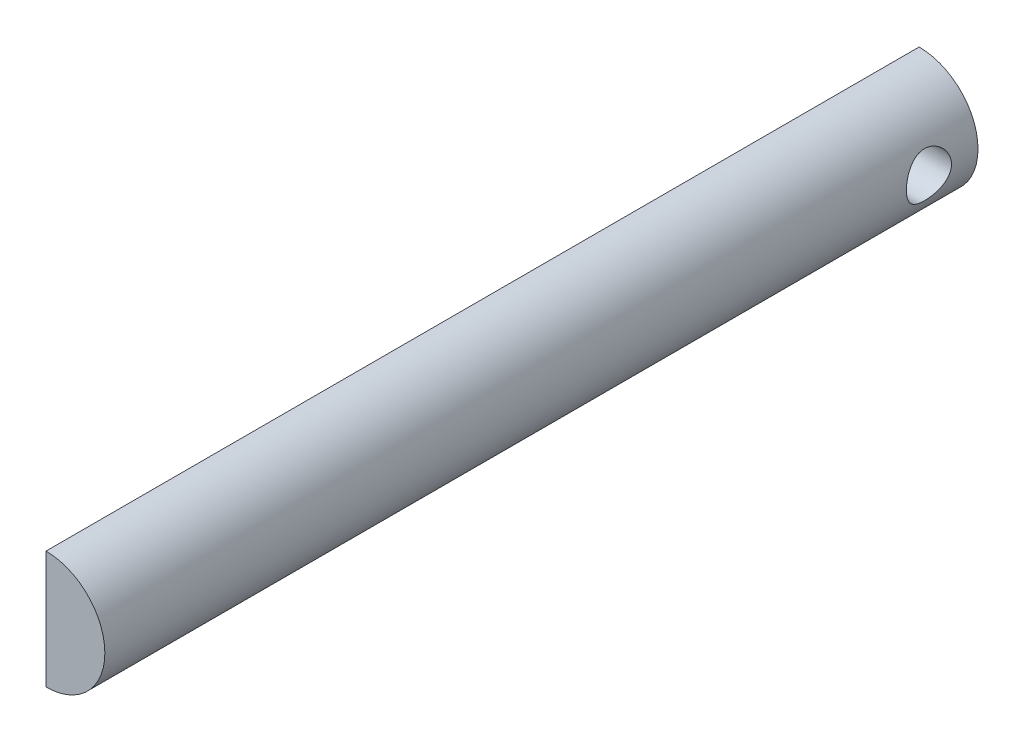
ISO-10303-21;
HEADER;
FILE_DESCRIPTION(('STEP AP214'),'2;1');
FILE_NAME('part.step','',(''),(''),'','','');
FILE_SCHEMA(('AUTOMOTIVE_DESIGN { 1 0 10303 214 1 1 1 1 }'));
ENDSEC;
DATA;
#1=APPLICATION_CONTEXT('core data for automotive mechanical design processes');
#2=APPLICATION_PROTOCOL_DEFINITION('international standard','automotive_design',2000,#1);
#3=PRODUCT_CONTEXT('',#1,'mechanical');
#4=PRODUCT('Part','Part','',(#3));
#5=PRODUCT_RELATED_PRODUCT_CATEGORY('part','',(#4));
#6=PRODUCT_DEFINITION_FORMATION('','',#4);
#7=PRODUCT_DEFINITION_CONTEXT('part definition',#1,'design');
#8=PRODUCT_DEFINITION('design','',#6,#7);
#9=PRODUCT_DEFINITION_SHAPE('','',#8);
#10=(LENGTH_UNIT() NAMED_UNIT(*) SI_UNIT(.MILLI.,.METRE.));
#11=(NAMED_UNIT(*) PLANE_ANGLE_UNIT() SI_UNIT($,.RADIAN.));
#12=(NAMED_UNIT(*) SI_UNIT($,.STERADIAN.) SOLID_ANGLE_UNIT());
#13=UNCERTAINTY_MEASURE_WITH_UNIT(LENGTH_MEASURE(1.E-05),#10,'distance_accuracy_value','');
#14=(GEOMETRIC_REPRESENTATION_CONTEXT(3) GLOBAL_UNCERTAINTY_ASSIGNED_CONTEXT((#13)) GLOBAL_UNIT_ASSIGNED_CONTEXT((#10,
#11,#12)) REPRESENTATION_CONTEXT('',''));
#15=CARTESIAN_POINT('',(0.,0.,0.));
#16=DIRECTION('',(0.,0.,1.));
#17=DIRECTION('',(1.,0.,0.));
#18=AXIS2_PLACEMENT_3D('',#15,#16,#17);
#19=CARTESIAN_POINT('',(0.,0.,44.5));
#20=DIRECTION('',(0.,0.,-1.));
#21=DIRECTION('',(-1.,0.,0.));
#22=AXIS2_PLACEMENT_3D('',#19,#20,#21);
#23=CYLINDRICAL_SURFACE('',#22,3.);
#24=CARTESIAN_POINT('',(3.,0.,3.64999999999999));
#25=CARTESIAN_POINT('',(3.00000206512941,0.0621812005652373,3.65000271461441));
#26=CARTESIAN_POINT('',(2.99805015708077,0.124344251109957,3.64494114376737));
#27=CARTESIAN_POINT('',(2.99045938894893,0.246807224807909,3.62491492714031));
#28=CARTESIAN_POINT('',(2.98482123946963,0.307107504705286,3.6099521900206));
#29=CARTESIAN_POINT('',(2.97046155141757,0.424060652478512,3.57073419968938));
#30=CARTESIAN_POINT('',(2.96174612628521,0.48072049071045,3.54649736284468));
#31=CARTESIAN_POINT('',(2.9420955444065,0.589164330281789,3.48951503180705));
#32=CARTESIAN_POINT('',(2.93115976537422,0.640946958744366,3.4567671515504));
#33=CARTESIAN_POINT('',(2.90765418147366,0.740449368476189,3.38218637502057));
#34=CARTESIAN_POINT('',(2.89503671481149,0.787925954962362,3.3400441906857));
#35=CARTESIAN_POINT('',(2.86981891802277,0.875335760926176,3.24852764137384));
#36=CARTESIAN_POINT('',(2.85721859481679,0.915266518271758,3.19915092513579));
#37=CARTESIAN_POINT('',(2.83290046694381,0.988032619939972,3.09215024785461));
#38=CARTESIAN_POINT('',(2.82123845053298,1.02051847959995,3.0342746588459));
#39=CARTESIAN_POINT('',(2.80086259497043,1.07518661251326,2.91336460307467));
#40=CARTESIAN_POINT('',(2.79214751834799,1.09737321206592,2.85033231554236));
#41=CARTESIAN_POINT('',(2.77916362792056,1.12984307704287,2.72370228739029));
#42=CARTESIAN_POINT('',(2.77472166980455,1.14059194266912,2.66024230235037));
#43=CARTESIAN_POINT('',(2.77028177584258,1.15133667417808,2.53227579741178));
#44=CARTESIAN_POINT('',(2.77028189710249,1.15133724119369,2.46776974739082));
#45=CARTESIAN_POINT('',(2.77457738954164,1.14094029840366,2.34387016234859));
#46=CARTESIAN_POINT('',(2.77860221810945,1.13119772329228,2.28441052225972));
#47=CARTESIAN_POINT('',(2.7900425486698,1.10267681892575,2.16804538812726));
#48=CARTESIAN_POINT('',(2.79745858501883,1.08389706564767,2.11114029815946));
#49=CARTESIAN_POINT('',(2.81500260823166,1.03748914024306,2.00019668018247));
#50=CARTESIAN_POINT('',(2.82518050595079,1.00969607489545,1.94623536900803));
#51=CARTESIAN_POINT('',(2.84708579051241,0.946165643243045,1.84355599548468));
#52=CARTESIAN_POINT('',(2.85881372828067,0.910425449219038,1.79483980861765));
#53=CARTESIAN_POINT('',(2.88350544373191,0.829051025475512,1.70042119967622));
#54=CARTESIAN_POINT('',(2.89649806630981,0.782897008171948,1.65517316751393));
#55=CARTESIAN_POINT('',(2.9215472054459,0.683509898159266,1.57292085721589));
#56=CARTESIAN_POINT('',(2.93360356469682,0.630275619910895,1.53591796245176));
#57=CARTESIAN_POINT('',(2.95568099600499,0.517037816977243,1.47067465855249));
#58=CARTESIAN_POINT('',(2.96566445534673,0.45693555889112,1.44259197299959));
#59=CARTESIAN_POINT('',(2.98219054141345,0.332381200532996,1.39708882422217));
#60=CARTESIAN_POINT('',(2.98873476775105,0.267931138223865,1.37966340360654));
#61=CARTESIAN_POINT('',(2.99736044433202,0.140329900363758,1.35685778520395));
#62=CARTESIAN_POINT('',(2.99966817841583,0.0773032202824069,1.35086611418011));
#63=CARTESIAN_POINT('',(3.00026454702987,-0.0488903423907071,1.34930939047274));
#64=CARTESIAN_POINT('',(2.99855412074252,-0.112057188773002,1.35374190129927));
#65=CARTESIAN_POINT('',(2.99145533514776,-0.234053542538173,1.37244772024682));
#66=CARTESIAN_POINT('',(2.9862188233959,-0.292955085193973,1.38631497650076));
#67=CARTESIAN_POINT('',(2.97274860930733,-0.407549830596902,1.42295618054144));
#68=CARTESIAN_POINT('',(2.96451451807191,-0.4632426159612,1.44573128403929));
#69=CARTESIAN_POINT('',(2.94555217330325,-0.571703983635002,1.50027534265838));
#70=CARTESIAN_POINT('',(2.93475681604268,-0.6243356869623,1.532292432021));
#71=CARTESIAN_POINT('',(2.91185847285852,-0.723658996595574,1.60413295576403));
#72=CARTESIAN_POINT('',(2.89975499023126,-0.770348331788937,1.64395936009889));
#73=CARTESIAN_POINT('',(2.87465759446169,-0.859426775218211,1.73312759766029));
#74=CARTESIAN_POINT('',(2.86165420237829,-0.901383263526978,1.78290007530389));
#75=CARTESIAN_POINT('',(2.83692255906153,-0.976440715290701,1.88902722165751));
#76=CARTESIAN_POINT('',(2.82519445123774,-1.00954068341317,1.94538262916296));
#77=CARTESIAN_POINT('',(2.804370173013,-1.0660320638182,2.06365930618227));
#78=CARTESIAN_POINT('',(2.79528974390917,-1.0893657557435,2.12561110651213));
#79=CARTESIAN_POINT('',(2.78109873468117,-1.12510743808757,2.25301261299283));
#80=CARTESIAN_POINT('',(2.77598554664395,-1.1375226066452,2.31845999098461));
#81=CARTESIAN_POINT('',(2.77066448129542,-1.15041836328925,2.44628362231087));
#82=CARTESIAN_POINT('',(2.77015167811567,-1.15164094588814,2.50857289431333));
#83=CARTESIAN_POINT('',(2.77330204940732,-1.1440334149176,2.63242082672161));
#84=CARTESIAN_POINT('',(2.7769647895978,-1.1352043467787,2.6939795624347));
#85=CARTESIAN_POINT('',(2.78779464391446,-1.10833148821198,2.8125290549292));
#86=CARTESIAN_POINT('',(2.79484086045719,-1.09060470556385,2.86960368098615));
#87=CARTESIAN_POINT('',(2.81156835083338,-1.04672441170889,2.97999872344295));
#88=CARTESIAN_POINT('',(2.82125030434399,-1.02056872662195,3.03331816702424));
#89=CARTESIAN_POINT('',(2.84280941489204,-0.958933760835818,3.13782662637724));
#90=CARTESIAN_POINT('',(2.8547769724341,-0.923026755150528,3.1887444867985));
#91=CARTESIAN_POINT('',(2.87925978787567,-0.843558207551879,3.28406832248017));
#92=CARTESIAN_POINT('',(2.8917752227663,-0.799994178137129,3.32847217293802));
#93=CARTESIAN_POINT('',(2.91680905819284,-0.70345380747129,3.4121187085979));
#94=CARTESIAN_POINT('',(2.92928616112468,-0.650080019466559,3.4509171807137));
#95=CARTESIAN_POINT('',(2.952085590559,-0.537129447283249,3.51898984300422));
#96=CARTESIAN_POINT('',(2.96240758180845,-0.477551700162888,3.54826255172908));
#97=CARTESIAN_POINT('',(2.98025954571167,-0.349927218147784,3.59773258513269));
#98=CARTESIAN_POINT('',(2.98757546147235,-0.281584090636319,3.61725073686846));
#99=CARTESIAN_POINT('',(2.99744316835554,-0.142151694728418,3.64337926197724));
#100=CARTESIAN_POINT('',(2.99999763985991,-0.0710639943679282,3.64999689759376));
#101=CARTESIAN_POINT('',(3.,0.,3.64999999999999));
#102=B_SPLINE_CURVE_WITH_KNOTS('',3,(#24,#25,#26,#27,#28,#29,#30,#31,#32,#33,#34,#35,#36,#37,
#38,#39,#40,#41,#42,#43,#44,#45,#46,#47,#48,#49,#50,#51,#52,#53,#54,#55,#56,#57,#58,#59,#60,#61,
#62,#63,#64,#65,#66,#67,#68,#69,#70,#71,#72,#73,#74,#75,#76,#77,#78,#79,#80,#81,#82,#83,#84,#85,
#86,#87,#88,#89,#90,#91,#92,#93,#94,#95,#96,#97,#98,#99,#100,#101),.UNSPECIFIED.,.T.,.F.,(4,2,2,
2,2,2,2,2,2,2,2,2,2,2,2,2,2,2,2,2,2,2,2,2,2,2,2,2,2,2,2,2,2,2,2,2,2,2,4),(0.,0.186281372232481,
0.372526845227211,0.558404378187764,0.744334078072657,0.937651683205603,1.13103225752526,
1.33218146436514,1.53324609999398,1.72576984294995,1.91820937911594,2.09852785060352,
2.2788747448748,2.46272707367025,2.64664492513065,2.84352503689751,3.04043815643708,
3.24066079643676,3.44079022880931,3.62987898402515,3.81892354708577,4.00030755828335,
4.18171511019594,4.36853674843354,4.5554295749491,4.7536587280064,4.95191014953021,
5.1513172677479,5.35059319200662,5.53655430411349,5.72249607694241,5.90223902640832,
6.08202837014211,6.27154075108446,6.46111481220273,6.66160111865403,6.86211858991698,
7.0751308314202,7.28802312469926),.UNSPECIFIED.);
#103=CARTESIAN_POINT('',(3.,0.,3.64999999999999));
#104=VERTEX_POINT('',#103);
#105=EDGE_CURVE('E11',#104,#104,#102,.T.);
#106=ORIENTED_EDGE('',*,*,#105,.T.);
#107=EDGE_LOOP('',(#106));
#108=FACE_BOUND('',#107,.T.);
#109=CARTESIAN_POINT('',(0.,0.,0.));
#110=DIRECTION('',(0.,0.,1.));
#111=DIRECTION('',(1.,0.,0.));
#112=AXIS2_PLACEMENT_3D('',#109,#110,#111);
#113=CIRCLE('',#112,3.);
#114=CARTESIAN_POINT('',(0.,-3.,0.));
#115=VERTEX_POINT('',#114);
#116=CARTESIAN_POINT('',(0.,3.,0.));
#117=VERTEX_POINT('',#116);
#118=EDGE_CURVE('E87',#115,#117,#113,.T.);
#119=ORIENTED_EDGE('',*,*,#118,.T.);
#120=DIRECTION('',(0.,0.,-1.));
#121=VECTOR('',#120,1.);
#122=CARTESIAN_POINT('',(0.,3.,44.5));
#123=LINE('',#122,#121);
#124=CARTESIAN_POINT('',(0.,3.,44.5));
#125=VERTEX_POINT('',#124);
#126=EDGE_CURVE('E61',#125,#117,#123,.T.);
#127=ORIENTED_EDGE('',*,*,#126,.F.);
#128=CARTESIAN_POINT('',(0.,0.,44.5));
#129=DIRECTION('',(0.,0.,1.));
#130=DIRECTION('',(1.,0.,0.));
#131=AXIS2_PLACEMENT_3D('',#128,#129,#130);
#132=CIRCLE('',#131,3.);
#133=CARTESIAN_POINT('',(0.,-3.,44.5));
#134=VERTEX_POINT('',#133);
#135=EDGE_CURVE('E86',#134,#125,#132,.T.);
#136=ORIENTED_EDGE('',*,*,#135,.F.);
#137=DIRECTION('',(0.,0.,-1.));
#138=VECTOR('',#137,1.);
#139=CARTESIAN_POINT('',(0.,-3.,44.5));
#140=LINE('',#139,#138);
#141=EDGE_CURVE('E81',#134,#115,#140,.T.);
#142=ORIENTED_EDGE('',*,*,#141,.T.);
#143=EDGE_LOOP('',(#119,#127,#136,#142));
#144=FACE_BOUND('',#143,.T.);
#145=ADVANCED_FACE('F47',(#108,#144),#23,.T.);
#146=CARTESIAN_POINT('',(0.,3.,44.5));
#147=DIRECTION('',(1.,0.,0.));
#148=DIRECTION('',(0.,0.,-1.));
#149=AXIS2_PLACEMENT_3D('',#146,#147,#148);
#150=PLANE('',#149);
#151=CARTESIAN_POINT('',(0.,0.,2.5));
#152=DIRECTION('',(-1.,0.,0.));
#153=DIRECTION('',(0.,0.,1.));
#154=AXIS2_PLACEMENT_3D('',#151,#152,#153);
#155=CIRCLE('',#154,1.14999999999999);
#156=CARTESIAN_POINT('',(0.,0.,3.64999999999999));
#157=VERTEX_POINT('',#156);
#158=EDGE_CURVE('E94',#157,#157,#155,.T.);
#159=ORIENTED_EDGE('',*,*,#158,.F.);
#160=EDGE_LOOP('',(#159));
#161=FACE_BOUND('',#160,.T.);
#162=DIRECTION('',(0.,-1.,0.));
#163=VECTOR('',#162,1.);
#164=CARTESIAN_POINT('',(0.,3.,0.));
#165=LINE('',#164,#163);
#166=EDGE_CURVE('E76',#117,#115,#165,.T.);
#167=ORIENTED_EDGE('',*,*,#166,.T.);
#168=ORIENTED_EDGE('',*,*,#141,.F.);
#169=DIRECTION('',(0.,-1.,0.));
#170=VECTOR('',#169,1.);
#171=CARTESIAN_POINT('',(0.,3.,44.5));
#172=LINE('',#171,#170);
#173=EDGE_CURVE('E68',#125,#134,#172,.T.);
#174=ORIENTED_EDGE('',*,*,#173,.F.);
#175=ORIENTED_EDGE('',*,*,#126,.T.);
#176=EDGE_LOOP('',(#167,#168,#174,#175));
#177=FACE_BOUND('',#176,.T.);
#178=ADVANCED_FACE('F80',(#161,#177),#150,.F.);
#179=CARTESIAN_POINT('',(0.,0.,44.5));
#180=DIRECTION('',(0.,0.,1.));
#181=DIRECTION('',(1.,0.,0.));
#182=AXIS2_PLACEMENT_3D('',#179,#180,#181);
#183=PLANE('',#182);
#184=ORIENTED_EDGE('',*,*,#135,.T.);
#185=ORIENTED_EDGE('',*,*,#173,.T.);
#186=EDGE_LOOP('',(#184,#185));
#187=FACE_BOUND('',#186,.T.);
#188=ADVANCED_FACE('F104',(#187),#183,.T.);
#189=CARTESIAN_POINT('',(0.,0.,0.));
#190=DIRECTION('',(0.,0.,1.));
#191=DIRECTION('',(1.,0.,0.));
#192=AXIS2_PLACEMENT_3D('',#189,#190,#191);
#193=PLANE('',#192);
#194=ORIENTED_EDGE('',*,*,#118,.F.);
#195=ORIENTED_EDGE('',*,*,#166,.F.);
#196=EDGE_LOOP('',(#194,#195));
#197=FACE_BOUND('',#196,.T.);
#198=ADVANCED_FACE('F92',(#197),#193,.F.);
#199=CARTESIAN_POINT('',(0.,0.,2.5));
#200=DIRECTION('',(-1.,0.,0.));
#201=DIRECTION('',(0.,0.,1.));
#202=AXIS2_PLACEMENT_3D('',#199,#200,#201);
#203=CYLINDRICAL_SURFACE('',#202,1.14999999999999);
#204=ORIENTED_EDGE('',*,*,#158,.T.);
#205=EDGE_LOOP('',(#204));
#206=FACE_BOUND('',#205,.T.);
#207=ORIENTED_EDGE('',*,*,#105,.F.);
#208=EDGE_LOOP('',(#207));
#209=FACE_BOUND('',#208,.T.);
#210=ADVANCED_FACE('F110',(#206,#209),#203,.F.);
#211=CLOSED_SHELL('',(#145,#178,#188,#198,#210));
#212=MANIFOLD_SOLID_BREP('B2',#211);
#213=ADVANCED_BREP_SHAPE_REPRESENTATION('',(#18,#212),#14);
#214=SHAPE_DEFINITION_REPRESENTATION(#9,#213);
ENDSEC;
END-ISO-10303-21;
